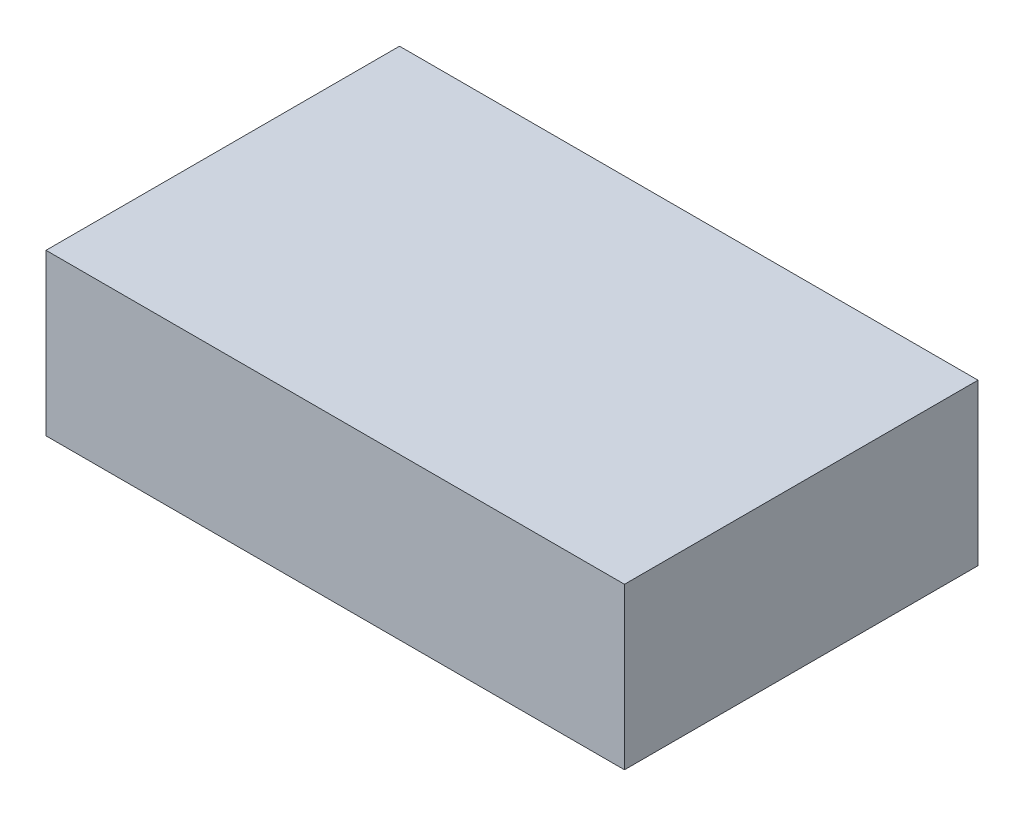
ISO-10303-21;
HEADER;
FILE_DESCRIPTION(('STEP AP214'),'2;1');
FILE_NAME('part.step','',(''),(''),'','','');
FILE_SCHEMA(('AUTOMOTIVE_DESIGN { 1 0 10303 214 1 1 1 1 }'));
ENDSEC;
DATA;
#1=APPLICATION_CONTEXT('core data for automotive mechanical design processes');
#2=APPLICATION_PROTOCOL_DEFINITION('international standard','automotive_design',2000,#1);
#3=PRODUCT_CONTEXT('',#1,'mechanical');
#4=PRODUCT('Part','Part','',(#3));
#5=PRODUCT_RELATED_PRODUCT_CATEGORY('part','',(#4));
#6=PRODUCT_DEFINITION_FORMATION('','',#4);
#7=PRODUCT_DEFINITION_CONTEXT('part definition',#1,'design');
#8=PRODUCT_DEFINITION('design','',#6,#7);
#9=PRODUCT_DEFINITION_SHAPE('','',#8);
#10=(LENGTH_UNIT() NAMED_UNIT(*) SI_UNIT(.MILLI.,.METRE.));
#11=(NAMED_UNIT(*) PLANE_ANGLE_UNIT() SI_UNIT($,.RADIAN.));
#12=(NAMED_UNIT(*) SI_UNIT($,.STERADIAN.) SOLID_ANGLE_UNIT());
#13=UNCERTAINTY_MEASURE_WITH_UNIT(LENGTH_MEASURE(1.E-05),#10,'distance_accuracy_value','');
#14=(GEOMETRIC_REPRESENTATION_CONTEXT(3) GLOBAL_UNCERTAINTY_ASSIGNED_CONTEXT((#13)) GLOBAL_UNIT_ASSIGNED_CONTEXT((#10,
#11,#12)) REPRESENTATION_CONTEXT('',''));
#15=CARTESIAN_POINT('',(0.,0.,0.));
#16=DIRECTION('',(0.,0.,1.));
#17=DIRECTION('',(1.,0.,0.));
#18=AXIS2_PLACEMENT_3D('',#15,#16,#17);
#19=CARTESIAN_POINT('',(0.,10.,0.));
#20=DIRECTION('',(1.,0.,0.));
#21=DIRECTION('',(0.,0.,-1.));
#22=AXIS2_PLACEMENT_3D('',#19,#20,#21);
#23=PLANE('',#22);
#24=DIRECTION('',(0.,0.,1.));
#25=VECTOR('',#24,1.);
#26=CARTESIAN_POINT('',(0.,0.,0.));
#27=LINE('',#26,#25);
#28=CARTESIAN_POINT('',(0.,0.,-22.));
#29=VERTEX_POINT('',#28);
#30=CARTESIAN_POINT('',(0.,0.,0.));
#31=VERTEX_POINT('',#30);
#32=EDGE_CURVE('E96',#29,#31,#27,.T.);
#33=ORIENTED_EDGE('',*,*,#32,.T.);
#34=DIRECTION('',(0.,-1.,0.));
#35=VECTOR('',#34,1.);
#36=CARTESIAN_POINT('',(0.,10.,0.));
#37=LINE('',#36,#35);
#38=CARTESIAN_POINT('',(0.,10.,0.));
#39=VERTEX_POINT('',#38);
#40=EDGE_CURVE('E11',#39,#31,#37,.T.);
#41=ORIENTED_EDGE('',*,*,#40,.F.);
#42=DIRECTION('',(0.,0.,1.));
#43=VECTOR('',#42,1.);
#44=CARTESIAN_POINT('',(0.,10.,0.));
#45=LINE('',#44,#43);
#46=CARTESIAN_POINT('',(0.,10.,-22.));
#47=VERTEX_POINT('',#46);
#48=EDGE_CURVE('E84',#47,#39,#45,.T.);
#49=ORIENTED_EDGE('',*,*,#48,.F.);
#50=DIRECTION('',(0.,-1.,0.));
#51=VECTOR('',#50,1.);
#52=CARTESIAN_POINT('',(0.,10.,-22.));
#53=LINE('',#52,#51);
#54=EDGE_CURVE('E92',#47,#29,#53,.T.);
#55=ORIENTED_EDGE('',*,*,#54,.T.);
#56=EDGE_LOOP('',(#33,#41,#49,#55));
#57=FACE_BOUND('',#56,.T.);
#58=ADVANCED_FACE('F33',(#57),#23,.F.);
#59=CARTESIAN_POINT('',(0.,10.,0.));
#60=DIRECTION('',(0.,0.,-1.));
#61=DIRECTION('',(-1.,0.,0.));
#62=AXIS2_PLACEMENT_3D('',#59,#60,#61);
#63=PLANE('',#62);
#64=DIRECTION('',(1.,0.,0.));
#65=VECTOR('',#64,1.);
#66=CARTESIAN_POINT('',(0.,0.,0.));
#67=LINE('',#66,#65);
#68=CARTESIAN_POINT('',(36.,0.,0.));
#69=VERTEX_POINT('',#68);
#70=EDGE_CURVE('E88',#31,#69,#67,.T.);
#71=ORIENTED_EDGE('',*,*,#70,.T.);
#72=DIRECTION('',(0.,-1.,0.));
#73=VECTOR('',#72,1.);
#74=CARTESIAN_POINT('',(36.,10.,0.));
#75=LINE('',#74,#73);
#76=CARTESIAN_POINT('',(36.,10.,0.));
#77=VERTEX_POINT('',#76);
#78=EDGE_CURVE('E41',#77,#69,#75,.T.);
#79=ORIENTED_EDGE('',*,*,#78,.F.);
#80=DIRECTION('',(1.,0.,0.));
#81=VECTOR('',#80,1.);
#82=CARTESIAN_POINT('',(0.,10.,0.));
#83=LINE('',#82,#81);
#84=EDGE_CURVE('E79',#39,#77,#83,.T.);
#85=ORIENTED_EDGE('',*,*,#84,.F.);
#86=ORIENTED_EDGE('',*,*,#40,.T.);
#87=EDGE_LOOP('',(#71,#79,#85,#86));
#88=FACE_BOUND('',#87,.T.);
#89=ADVANCED_FACE('F87',(#88),#63,.F.);
#90=CARTESIAN_POINT('',(36.,10.,0.));
#91=DIRECTION('',(-1.,0.,0.));
#92=DIRECTION('',(0.,0.,1.));
#93=AXIS2_PLACEMENT_3D('',#90,#91,#92);
#94=PLANE('',#93);
#95=DIRECTION('',(0.,0.,-1.));
#96=VECTOR('',#95,1.);
#97=CARTESIAN_POINT('',(36.,0.,0.));
#98=LINE('',#97,#96);
#99=CARTESIAN_POINT('',(36.,0.,-22.));
#100=VERTEX_POINT('',#99);
#101=EDGE_CURVE('E66',#69,#100,#98,.T.);
#102=ORIENTED_EDGE('',*,*,#101,.T.);
#103=DIRECTION('',(0.,-1.,0.));
#104=VECTOR('',#103,1.);
#105=CARTESIAN_POINT('',(36.,10.,-22.));
#106=LINE('',#105,#104);
#107=CARTESIAN_POINT('',(36.,10.,-22.));
#108=VERTEX_POINT('',#107);
#109=EDGE_CURVE('E89',#108,#100,#106,.T.);
#110=ORIENTED_EDGE('',*,*,#109,.F.);
#111=DIRECTION('',(0.,0.,-1.));
#112=VECTOR('',#111,1.);
#113=CARTESIAN_POINT('',(36.,10.,0.));
#114=LINE('',#113,#112);
#115=EDGE_CURVE('E82',#77,#108,#114,.T.);
#116=ORIENTED_EDGE('',*,*,#115,.F.);
#117=ORIENTED_EDGE('',*,*,#78,.T.);
#118=EDGE_LOOP('',(#102,#110,#116,#117));
#119=FACE_BOUND('',#118,.T.);
#120=ADVANCED_FACE('F90',(#119),#94,.F.);
#121=CARTESIAN_POINT('',(0.,10.,-22.));
#122=DIRECTION('',(0.,0.,1.));
#123=DIRECTION('',(1.,0.,0.));
#124=AXIS2_PLACEMENT_3D('',#121,#122,#123);
#125=PLANE('',#124);
#126=DIRECTION('',(-1.,0.,0.));
#127=VECTOR('',#126,1.);
#128=CARTESIAN_POINT('',(0.,0.,-22.));
#129=LINE('',#128,#127);
#130=EDGE_CURVE('E72',#100,#29,#129,.T.);
#131=ORIENTED_EDGE('',*,*,#130,.T.);
#132=ORIENTED_EDGE('',*,*,#54,.F.);
#133=DIRECTION('',(-1.,0.,0.));
#134=VECTOR('',#133,1.);
#135=CARTESIAN_POINT('',(0.,10.,-22.));
#136=LINE('',#135,#134);
#137=EDGE_CURVE('E49',#108,#47,#136,.T.);
#138=ORIENTED_EDGE('',*,*,#137,.F.);
#139=ORIENTED_EDGE('',*,*,#109,.T.);
#140=EDGE_LOOP('',(#131,#132,#138,#139));
#141=FACE_BOUND('',#140,.T.);
#142=ADVANCED_FACE('F103',(#141),#125,.F.);
#143=CARTESIAN_POINT('',(0.,10.,0.));
#144=DIRECTION('',(0.,-1.,0.));
#145=DIRECTION('',(0.,0.,-1.));
#146=AXIS2_PLACEMENT_3D('',#143,#144,#145);
#147=PLANE('',#146);
#148=ORIENTED_EDGE('',*,*,#48,.T.);
#149=ORIENTED_EDGE('',*,*,#84,.T.);
#150=ORIENTED_EDGE('',*,*,#115,.T.);
#151=ORIENTED_EDGE('',*,*,#137,.T.);
#152=EDGE_LOOP('',(#148,#149,#150,#151));
#153=FACE_BOUND('',#152,.T.);
#154=ADVANCED_FACE('F80',(#153),#147,.F.);
#155=CARTESIAN_POINT('',(0.,0.,0.));
#156=DIRECTION('',(0.,-1.,0.));
#157=DIRECTION('',(0.,0.,-1.));
#158=AXIS2_PLACEMENT_3D('',#155,#156,#157);
#159=PLANE('',#158);
#160=ORIENTED_EDGE('',*,*,#32,.F.);
#161=ORIENTED_EDGE('',*,*,#130,.F.);
#162=ORIENTED_EDGE('',*,*,#101,.F.);
#163=ORIENTED_EDGE('',*,*,#70,.F.);
#164=EDGE_LOOP('',(#160,#161,#162,#163));
#165=FACE_BOUND('',#164,.T.);
#166=ADVANCED_FACE('F106',(#165),#159,.T.);
#167=CLOSED_SHELL('',(#58,#89,#120,#142,#154,#166));
#168=MANIFOLD_SOLID_BREP('B2',#167);
#169=ADVANCED_BREP_SHAPE_REPRESENTATION('',(#18,#168),#14);
#170=SHAPE_DEFINITION_REPRESENTATION(#9,#169);
ENDSEC;
END-ISO-10303-21;
